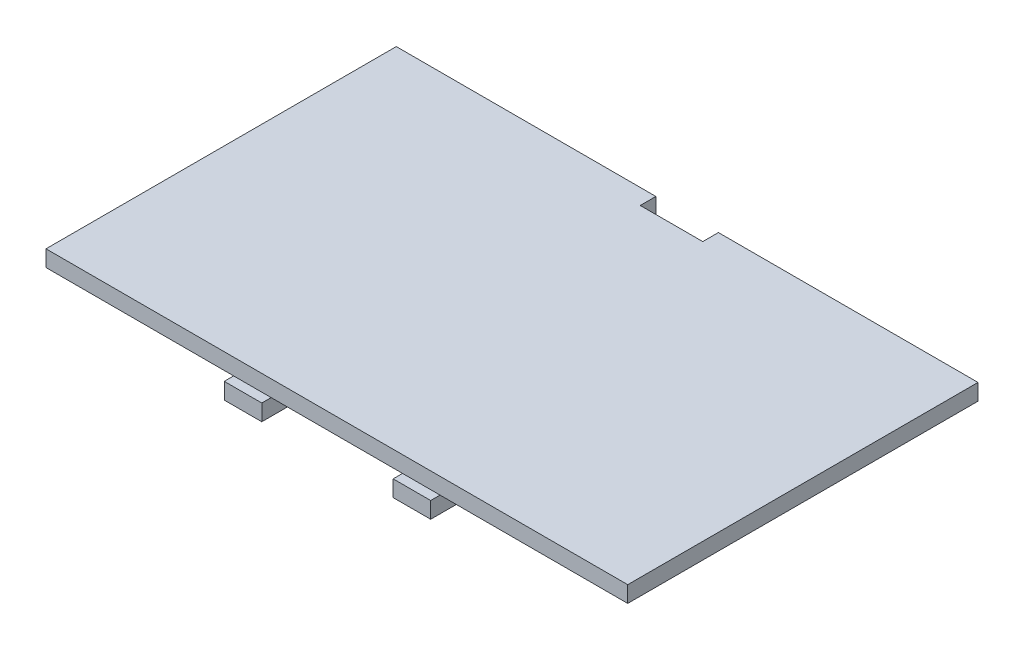
ISO-10303-21;
HEADER;
FILE_DESCRIPTION(('STEP AP214'),'2;1');
FILE_NAME('part.step','',(''),(''),'','','');
FILE_SCHEMA(('AUTOMOTIVE_DESIGN { 1 0 10303 214 1 1 1 1 }'));
ENDSEC;
DATA;
#1=APPLICATION_CONTEXT('core data for automotive mechanical design processes');
#2=APPLICATION_PROTOCOL_DEFINITION('international standard','automotive_design',2000,#1);
#3=PRODUCT_CONTEXT('',#1,'mechanical');
#4=PRODUCT('Part','Part','',(#3));
#5=PRODUCT_RELATED_PRODUCT_CATEGORY('part','',(#4));
#6=PRODUCT_DEFINITION_FORMATION('','',#4);
#7=PRODUCT_DEFINITION_CONTEXT('part definition',#1,'design');
#8=PRODUCT_DEFINITION('design','',#6,#7);
#9=PRODUCT_DEFINITION_SHAPE('','',#8);
#10=(LENGTH_UNIT() NAMED_UNIT(*) SI_UNIT(.MILLI.,.METRE.));
#11=(NAMED_UNIT(*) PLANE_ANGLE_UNIT() SI_UNIT($,.RADIAN.));
#12=(NAMED_UNIT(*) SI_UNIT($,.STERADIAN.) SOLID_ANGLE_UNIT());
#13=UNCERTAINTY_MEASURE_WITH_UNIT(LENGTH_MEASURE(1.E-05),#10,'distance_accuracy_value','');
#14=(GEOMETRIC_REPRESENTATION_CONTEXT(3) GLOBAL_UNCERTAINTY_ASSIGNED_CONTEXT((#13)) GLOBAL_UNIT_ASSIGNED_CONTEXT((#10,
#11,#12)) REPRESENTATION_CONTEXT('',''));
#15=CARTESIAN_POINT('',(0.,0.,0.));
#16=DIRECTION('',(0.,0.,1.));
#17=DIRECTION('',(1.,0.,0.));
#18=AXIS2_PLACEMENT_3D('',#15,#16,#17);
#19=CARTESIAN_POINT('',(-46.5,2.6,-28.));
#20=DIRECTION('',(0.,0.,1.));
#21=DIRECTION('',(1.,0.,0.));
#22=AXIS2_PLACEMENT_3D('',#19,#20,#21);
#23=PLANE('',#22);
#24=DIRECTION('',(0.,1.,0.));
#25=VECTOR('',#24,1.);
#26=CARTESIAN_POINT('',(4.99999999999999,0.,-28.));
#27=LINE('',#26,#25);
#28=CARTESIAN_POINT('',(4.99999999999999,0.,-28.));
#29=VERTEX_POINT('',#28);
#30=CARTESIAN_POINT('',(4.99999999999999,2.6,-28.));
#31=VERTEX_POINT('',#30);
#32=EDGE_CURVE('E280',#29,#31,#27,.T.);
#33=ORIENTED_EDGE('',*,*,#32,.T.);
#34=DIRECTION('',(-1.,0.,0.));
#35=VECTOR('',#34,1.);
#36=CARTESIAN_POINT('',(-46.5,2.6,-28.));
#37=LINE('',#36,#35);
#38=CARTESIAN_POINT('',(46.5,2.6,-28.));
#39=VERTEX_POINT('',#38);
#40=EDGE_CURVE('E289',#39,#31,#37,.T.);
#41=ORIENTED_EDGE('',*,*,#40,.F.);
#42=DIRECTION('',(0.,-1.,0.));
#43=VECTOR('',#42,1.);
#44=CARTESIAN_POINT('',(46.5,2.6,-28.));
#45=LINE('',#44,#43);
#46=CARTESIAN_POINT('',(46.5,0.,-28.));
#47=VERTEX_POINT('',#46);
#48=EDGE_CURVE('E12',#39,#47,#45,.T.);
#49=ORIENTED_EDGE('',*,*,#48,.T.);
#50=DIRECTION('',(-1.,0.,0.));
#51=VECTOR('',#50,1.);
#52=CARTESIAN_POINT('',(-46.5,0.,-28.));
#53=LINE('',#52,#51);
#54=EDGE_CURVE('E300',#47,#29,#53,.T.);
#55=ORIENTED_EDGE('',*,*,#54,.T.);
#56=EDGE_LOOP('',(#33,#41,#49,#55));
#57=FACE_BOUND('',#56,.T.);
#58=ADVANCED_FACE('F60',(#57),#23,.F.);
#59=DIRECTION('',(0.,1.,0.));
#60=VECTOR('',#59,1.);
#61=CARTESIAN_POINT('',(-5.00000000000001,0.,-28.));
#62=LINE('',#61,#60);
#63=CARTESIAN_POINT('',(-5.00000000000001,0.,-28.));
#64=VERTEX_POINT('',#63);
#65=CARTESIAN_POINT('',(-5.00000000000001,2.6,-28.));
#66=VERTEX_POINT('',#65);
#67=EDGE_CURVE('E267',#64,#66,#62,.T.);
#68=ORIENTED_EDGE('',*,*,#67,.F.);
#69=CARTESIAN_POINT('',(-46.5,0.,-28.));
#70=VERTEX_POINT('',#69);
#71=EDGE_CURVE('E299',#64,#70,#53,.T.);
#72=ORIENTED_EDGE('',*,*,#71,.T.);
#73=DIRECTION('',(0.,-1.,0.));
#74=VECTOR('',#73,1.);
#75=CARTESIAN_POINT('',(-46.5,2.6,-28.));
#76=LINE('',#75,#74);
#77=CARTESIAN_POINT('',(-46.5,2.6,-28.));
#78=VERTEX_POINT('',#77);
#79=EDGE_CURVE('E68',#78,#70,#76,.T.);
#80=ORIENTED_EDGE('',*,*,#79,.F.);
#81=EDGE_CURVE('E287',#66,#78,#37,.T.);
#82=ORIENTED_EDGE('',*,*,#81,.F.);
#83=EDGE_LOOP('',(#68,#72,#80,#82));
#84=FACE_BOUND('',#83,.T.);
#85=ADVANCED_FACE('F335',(#84),#23,.F.);
#86=CARTESIAN_POINT('',(0.,2.6,0.));
#87=DIRECTION('',(0.,-1.,0.));
#88=DIRECTION('',(0.,0.,-1.));
#89=AXIS2_PLACEMENT_3D('',#86,#87,#88);
#90=PLANE('',#89);
#91=DIRECTION('',(0.,0.,1.));
#92=VECTOR('',#91,1.);
#93=CARTESIAN_POINT('',(4.99999999999999,2.6,-28.));
#94=LINE('',#93,#92);
#95=CARTESIAN_POINT('',(4.99999999999999,2.6,-25.5));
#96=VERTEX_POINT('',#95);
#97=EDGE_CURVE('E258',#31,#96,#94,.T.);
#98=ORIENTED_EDGE('',*,*,#97,.T.);
#99=DIRECTION('',(-1.,0.,0.));
#100=VECTOR('',#99,1.);
#101=CARTESIAN_POINT('',(4.99999999999999,2.6,-25.5));
#102=LINE('',#101,#100);
#103=CARTESIAN_POINT('',(-5.00000000000001,2.6,-25.5));
#104=VERTEX_POINT('',#103);
#105=EDGE_CURVE('E270',#96,#104,#102,.T.);
#106=ORIENTED_EDGE('',*,*,#105,.T.);
#107=DIRECTION('',(0.,0.,-1.));
#108=VECTOR('',#107,1.);
#109=CARTESIAN_POINT('',(-5.00000000000001,2.6,-25.5));
#110=LINE('',#109,#108);
#111=EDGE_CURVE('E262',#104,#66,#110,.T.);
#112=ORIENTED_EDGE('',*,*,#111,.T.);
#113=ORIENTED_EDGE('',*,*,#81,.T.);
#114=DIRECTION('',(0.,0.,1.));
#115=VECTOR('',#114,1.);
#116=CARTESIAN_POINT('',(-46.5,2.6,28.));
#117=LINE('',#116,#115);
#118=CARTESIAN_POINT('',(-46.5,2.6,28.));
#119=VERTEX_POINT('',#118);
#120=EDGE_CURVE('E292',#78,#119,#117,.T.);
#121=ORIENTED_EDGE('',*,*,#120,.T.);
#122=DIRECTION('',(1.,0.,0.));
#123=VECTOR('',#122,1.);
#124=CARTESIAN_POINT('',(-46.5,2.6,28.));
#125=LINE('',#124,#123);
#126=CARTESIAN_POINT('',(46.5,2.6,28.));
#127=VERTEX_POINT('',#126);
#128=EDGE_CURVE('E294',#119,#127,#125,.T.);
#129=ORIENTED_EDGE('',*,*,#128,.T.);
#130=DIRECTION('',(0.,0.,-1.));
#131=VECTOR('',#130,1.);
#132=CARTESIAN_POINT('',(46.5,2.6,28.));
#133=LINE('',#132,#131);
#134=EDGE_CURVE('E284',#127,#39,#133,.T.);
#135=ORIENTED_EDGE('',*,*,#134,.T.);
#136=ORIENTED_EDGE('',*,*,#40,.T.);
#137=EDGE_LOOP('',(#98,#106,#112,#113,#121,#129,#135,#136));
#138=FACE_BOUND('',#137,.T.);
#139=ADVANCED_FACE('F331',(#138),#90,.F.);
#140=CARTESIAN_POINT('',(0.,0.,0.));
#141=DIRECTION('',(0.,-1.,0.));
#142=DIRECTION('',(0.,0.,-1.));
#143=AXIS2_PLACEMENT_3D('',#140,#141,#142);
#144=PLANE('',#143);
#145=DIRECTION('',(0.,0.,-1.));
#146=VECTOR('',#145,1.);
#147=CARTESIAN_POINT('',(-10.5,0.,0.));
#148=LINE('',#147,#146);
#149=CARTESIAN_POINT('',(-10.5,0.,28.));
#150=VERTEX_POINT('',#149);
#151=CARTESIAN_POINT('',(-10.5,0.,25.));
#152=VERTEX_POINT('',#151);
#153=EDGE_CURVE('E191',#150,#152,#148,.T.);
#154=ORIENTED_EDGE('',*,*,#153,.T.);
#155=DIRECTION('',(-1.,0.,0.));
#156=VECTOR('',#155,1.);
#157=CARTESIAN_POINT('',(0.,0.,25.));
#158=LINE('',#157,#156);
#159=CARTESIAN_POINT('',(-16.5,0.,25.));
#160=VERTEX_POINT('',#159);
#161=EDGE_CURVE('E202',#152,#160,#158,.T.);
#162=ORIENTED_EDGE('',*,*,#161,.T.);
#163=DIRECTION('',(0.,0.,-1.));
#164=VECTOR('',#163,1.);
#165=CARTESIAN_POINT('',(-16.5000000000001,0.,0.));
#166=LINE('',#165,#164);
#167=CARTESIAN_POINT('',(-16.5,0.,28.));
#168=VERTEX_POINT('',#167);
#169=EDGE_CURVE('E207',#168,#160,#166,.T.);
#170=ORIENTED_EDGE('',*,*,#169,.F.);
#171=DIRECTION('',(1.,0.,0.));
#172=VECTOR('',#171,1.);
#173=CARTESIAN_POINT('',(-46.5,0.,28.));
#174=LINE('',#173,#172);
#175=CARTESIAN_POINT('',(-46.5,0.,28.));
#176=VERTEX_POINT('',#175);
#177=EDGE_CURVE('E288',#176,#168,#174,.T.);
#178=ORIENTED_EDGE('',*,*,#177,.F.);
#179=DIRECTION('',(0.,0.,1.));
#180=VECTOR('',#179,1.);
#181=CARTESIAN_POINT('',(-46.5,0.,28.));
#182=LINE('',#181,#180);
#183=EDGE_CURVE('E303',#70,#176,#182,.T.);
#184=ORIENTED_EDGE('',*,*,#183,.F.);
#185=ORIENTED_EDGE('',*,*,#71,.F.);
#186=DIRECTION('',(0.,0.,-1.));
#187=VECTOR('',#186,1.);
#188=CARTESIAN_POINT('',(-5.00000000000001,0.,-25.5));
#189=LINE('',#188,#187);
#190=CARTESIAN_POINT('',(-5.00000000000001,0.,-25.5));
#191=VERTEX_POINT('',#190);
#192=EDGE_CURVE('E265',#191,#64,#189,.T.);
#193=ORIENTED_EDGE('',*,*,#192,.F.);
#194=DIRECTION('',(-1.,0.,0.));
#195=VECTOR('',#194,1.);
#196=CARTESIAN_POINT('',(4.99999999999999,0.,-25.5));
#197=LINE('',#196,#195);
#198=CARTESIAN_POINT('',(4.99999999999999,0.,-25.5));
#199=VERTEX_POINT('',#198);
#200=EDGE_CURVE('E261',#199,#191,#197,.T.);
#201=ORIENTED_EDGE('',*,*,#200,.F.);
#202=DIRECTION('',(0.,0.,1.));
#203=VECTOR('',#202,1.);
#204=CARTESIAN_POINT('',(4.99999999999999,0.,-28.));
#205=LINE('',#204,#203);
#206=EDGE_CURVE('E259',#29,#199,#205,.T.);
#207=ORIENTED_EDGE('',*,*,#206,.F.);
#208=ORIENTED_EDGE('',*,*,#54,.F.);
#209=DIRECTION('',(0.,0.,-1.));
#210=VECTOR('',#209,1.);
#211=CARTESIAN_POINT('',(46.5,0.,28.));
#212=LINE('',#211,#210);
#213=CARTESIAN_POINT('',(46.5,0.,28.));
#214=VERTEX_POINT('',#213);
#215=EDGE_CURVE('E283',#214,#47,#212,.T.);
#216=ORIENTED_EDGE('',*,*,#215,.F.);
#217=CARTESIAN_POINT('',(16.5,0.,28.));
#218=VERTEX_POINT('',#217);
#219=EDGE_CURVE('E305',#218,#214,#174,.T.);
#220=ORIENTED_EDGE('',*,*,#219,.F.);
#221=DIRECTION('',(0.,0.,1.));
#222=VECTOR('',#221,1.);
#223=CARTESIAN_POINT('',(16.5,0.,0.));
#224=LINE('',#223,#222);
#225=CARTESIAN_POINT('',(16.5,0.,25.));
#226=VERTEX_POINT('',#225);
#227=EDGE_CURVE('E229',#226,#218,#224,.T.);
#228=ORIENTED_EDGE('',*,*,#227,.F.);
#229=DIRECTION('',(-1.,0.,0.));
#230=VECTOR('',#229,1.);
#231=CARTESIAN_POINT('',(0.,0.,25.));
#232=LINE('',#231,#230);
#233=CARTESIAN_POINT('',(10.5,0.,25.));
#234=VERTEX_POINT('',#233);
#235=EDGE_CURVE('E243',#226,#234,#232,.T.);
#236=ORIENTED_EDGE('',*,*,#235,.T.);
#237=DIRECTION('',(0.,0.,1.));
#238=VECTOR('',#237,1.);
#239=CARTESIAN_POINT('',(10.5,0.,0.));
#240=LINE('',#239,#238);
#241=CARTESIAN_POINT('',(10.5,0.,28.));
#242=VERTEX_POINT('',#241);
#243=EDGE_CURVE('E241',#234,#242,#240,.T.);
#244=ORIENTED_EDGE('',*,*,#243,.T.);
#245=EDGE_CURVE('E83',#150,#242,#174,.T.);
#246=ORIENTED_EDGE('',*,*,#245,.F.);
#247=EDGE_LOOP('',(#154,#162,#170,#178,#184,#185,#193,#201,#207,#208,#216,#220,#228,#236,#244,#246));
#248=FACE_BOUND('',#247,.T.);
#249=ADVANCED_FACE('F209',(#248),#144,.T.);
#250=CARTESIAN_POINT('',(46.5,2.6,28.));
#251=DIRECTION('',(-1.,0.,0.));
#252=DIRECTION('',(0.,0.,1.));
#253=AXIS2_PLACEMENT_3D('',#250,#251,#252);
#254=PLANE('',#253);
#255=ORIENTED_EDGE('',*,*,#215,.T.);
#256=ORIENTED_EDGE('',*,*,#48,.F.);
#257=ORIENTED_EDGE('',*,*,#134,.F.);
#258=DIRECTION('',(0.,-1.,0.));
#259=VECTOR('',#258,1.);
#260=CARTESIAN_POINT('',(46.5,2.6,28.));
#261=LINE('',#260,#259);
#262=EDGE_CURVE('E296',#127,#214,#261,.T.);
#263=ORIENTED_EDGE('',*,*,#262,.T.);
#264=EDGE_LOOP('',(#255,#256,#257,#263));
#265=FACE_BOUND('',#264,.T.);
#266=ADVANCED_FACE('F62',(#265),#254,.F.);
#267=CARTESIAN_POINT('',(-46.5,2.6,28.));
#268=DIRECTION('',(1.,0.,0.));
#269=DIRECTION('',(0.,0.,-1.));
#270=AXIS2_PLACEMENT_3D('',#267,#268,#269);
#271=PLANE('',#270);
#272=ORIENTED_EDGE('',*,*,#183,.T.);
#273=DIRECTION('',(0.,-1.,0.));
#274=VECTOR('',#273,1.);
#275=CARTESIAN_POINT('',(-46.5,2.6,28.));
#276=LINE('',#275,#274);
#277=EDGE_CURVE('E312',#119,#176,#276,.T.);
#278=ORIENTED_EDGE('',*,*,#277,.F.);
#279=ORIENTED_EDGE('',*,*,#120,.F.);
#280=ORIENTED_EDGE('',*,*,#79,.T.);
#281=EDGE_LOOP('',(#272,#278,#279,#280));
#282=FACE_BOUND('',#281,.T.);
#283=ADVANCED_FACE('F319',(#282),#271,.F.);
#284=CARTESIAN_POINT('',(-46.5,2.6,28.));
#285=DIRECTION('',(0.,0.,-1.));
#286=DIRECTION('',(-1.,0.,0.));
#287=AXIS2_PLACEMENT_3D('',#284,#285,#286);
#288=PLANE('',#287);
#289=ORIENTED_EDGE('',*,*,#177,.T.);
#290=EDGE_CURVE('E308',#168,#150,#174,.T.);
#291=ORIENTED_EDGE('',*,*,#290,.T.);
#292=ORIENTED_EDGE('',*,*,#245,.T.);
#293=EDGE_CURVE('E309',#242,#218,#174,.T.);
#294=ORIENTED_EDGE('',*,*,#293,.T.);
#295=ORIENTED_EDGE('',*,*,#219,.T.);
#296=ORIENTED_EDGE('',*,*,#262,.F.);
#297=ORIENTED_EDGE('',*,*,#128,.F.);
#298=ORIENTED_EDGE('',*,*,#277,.T.);
#299=EDGE_LOOP('',(#289,#291,#292,#294,#295,#296,#297,#298));
#300=FACE_BOUND('',#299,.T.);
#301=ADVANCED_FACE('F326',(#300),#288,.F.);
#302=CARTESIAN_POINT('',(4.99999999999999,0.,-28.));
#303=DIRECTION('',(-1.,0.,0.));
#304=DIRECTION('',(0.,0.,1.));
#305=AXIS2_PLACEMENT_3D('',#302,#303,#304);
#306=PLANE('',#305);
#307=ORIENTED_EDGE('',*,*,#97,.F.);
#308=ORIENTED_EDGE('',*,*,#32,.F.);
#309=ORIENTED_EDGE('',*,*,#206,.T.);
#310=DIRECTION('',(0.,1.,0.));
#311=VECTOR('',#310,1.);
#312=CARTESIAN_POINT('',(4.99999999999999,0.,-25.5));
#313=LINE('',#312,#311);
#314=EDGE_CURVE('E278',#199,#96,#313,.T.);
#315=ORIENTED_EDGE('',*,*,#314,.T.);
#316=EDGE_LOOP('',(#307,#308,#309,#315));
#317=FACE_BOUND('',#316,.T.);
#318=ADVANCED_FACE('F345',(#317),#306,.T.);
#319=CARTESIAN_POINT('',(4.99999999999999,0.,-25.5));
#320=DIRECTION('',(0.,0.,-1.));
#321=DIRECTION('',(-1.,0.,0.));
#322=AXIS2_PLACEMENT_3D('',#319,#320,#321);
#323=PLANE('',#322);
#324=ORIENTED_EDGE('',*,*,#105,.F.);
#325=ORIENTED_EDGE('',*,*,#314,.F.);
#326=ORIENTED_EDGE('',*,*,#200,.T.);
#327=DIRECTION('',(0.,1.,0.));
#328=VECTOR('',#327,1.);
#329=CARTESIAN_POINT('',(-5.00000000000001,0.,-25.5));
#330=LINE('',#329,#328);
#331=EDGE_CURVE('E276',#191,#104,#330,.T.);
#332=ORIENTED_EDGE('',*,*,#331,.T.);
#333=EDGE_LOOP('',(#324,#325,#326,#332));
#334=FACE_BOUND('',#333,.T.);
#335=ADVANCED_FACE('F343',(#334),#323,.T.);
#336=CARTESIAN_POINT('',(-5.00000000000001,0.,-25.5));
#337=DIRECTION('',(1.,0.,0.));
#338=DIRECTION('',(0.,0.,-1.));
#339=AXIS2_PLACEMENT_3D('',#336,#337,#338);
#340=PLANE('',#339);
#341=ORIENTED_EDGE('',*,*,#111,.F.);
#342=ORIENTED_EDGE('',*,*,#331,.F.);
#343=ORIENTED_EDGE('',*,*,#192,.T.);
#344=ORIENTED_EDGE('',*,*,#67,.T.);
#345=EDGE_LOOP('',(#341,#342,#343,#344));
#346=FACE_BOUND('',#345,.T.);
#347=ADVANCED_FACE('F337',(#346),#340,.T.);
#348=CARTESIAN_POINT('',(0.,-2.6,29.5));
#349=DIRECTION('',(0.,0.,1.));
#350=DIRECTION('',(1.,0.,0.));
#351=AXIS2_PLACEMENT_3D('',#348,#349,#350);
#352=PLANE('',#351);
#353=DIRECTION('',(1.,0.,0.));
#354=VECTOR('',#353,1.);
#355=CARTESIAN_POINT('',(0.,0.,29.5));
#356=LINE('',#355,#354);
#357=CARTESIAN_POINT('',(10.5,0.,29.5));
#358=VERTEX_POINT('',#357);
#359=CARTESIAN_POINT('',(16.5,0.,29.5));
#360=VERTEX_POINT('',#359);
#361=EDGE_CURVE('E213',#358,#360,#356,.T.);
#362=ORIENTED_EDGE('',*,*,#361,.F.);
#363=DIRECTION('',(0.,1.,0.));
#364=VECTOR('',#363,1.);
#365=CARTESIAN_POINT('',(10.5,-2.6,29.5));
#366=LINE('',#365,#364);
#367=CARTESIAN_POINT('',(10.5,-2.6,29.5));
#368=VERTEX_POINT('',#367);
#369=EDGE_CURVE('E255',#368,#358,#366,.T.);
#370=ORIENTED_EDGE('',*,*,#369,.F.);
#371=DIRECTION('',(1.,0.,0.));
#372=VECTOR('',#371,1.);
#373=CARTESIAN_POINT('',(0.,-2.6,29.5));
#374=LINE('',#373,#372);
#375=CARTESIAN_POINT('',(16.5,-2.6,29.5));
#376=VERTEX_POINT('',#375);
#377=EDGE_CURVE('E225',#368,#376,#374,.T.);
#378=ORIENTED_EDGE('',*,*,#377,.T.);
#379=DIRECTION('',(0.,1.,0.));
#380=VECTOR('',#379,1.);
#381=CARTESIAN_POINT('',(16.5,-2.6,29.5));
#382=LINE('',#381,#380);
#383=EDGE_CURVE('E237',#376,#360,#382,.T.);
#384=ORIENTED_EDGE('',*,*,#383,.T.);
#385=EDGE_LOOP('',(#362,#370,#378,#384));
#386=FACE_BOUND('',#385,.T.);
#387=ADVANCED_FACE('F373',(#386),#352,.T.);
#388=CARTESIAN_POINT('',(10.5,-2.6,0.));
#389=DIRECTION('',(-1.,0.,0.));
#390=DIRECTION('',(0.,0.,1.));
#391=AXIS2_PLACEMENT_3D('',#388,#389,#390);
#392=PLANE('',#391);
#393=ORIENTED_EDGE('',*,*,#243,.F.);
#394=DIRECTION('',(0.,1.,0.));
#395=VECTOR('',#394,1.);
#396=CARTESIAN_POINT('',(10.5,-2.6,25.));
#397=LINE('',#396,#395);
#398=CARTESIAN_POINT('',(10.5,-2.6,25.));
#399=VERTEX_POINT('',#398);
#400=EDGE_CURVE('E253',#399,#234,#397,.T.);
#401=ORIENTED_EDGE('',*,*,#400,.F.);
#402=DIRECTION('',(0.,0.,1.));
#403=VECTOR('',#402,1.);
#404=CARTESIAN_POINT('',(10.5,-2.6,0.));
#405=LINE('',#404,#403);
#406=EDGE_CURVE('E228',#399,#368,#405,.T.);
#407=ORIENTED_EDGE('',*,*,#406,.T.);
#408=ORIENTED_EDGE('',*,*,#369,.T.);
#409=EDGE_CURVE('E240',#242,#358,#240,.T.);
#410=ORIENTED_EDGE('',*,*,#409,.F.);
#411=EDGE_LOOP('',(#393,#401,#407,#408,#410));
#412=FACE_BOUND('',#411,.T.);
#413=ADVANCED_FACE('F376',(#412),#392,.T.);
#414=CARTESIAN_POINT('',(0.,-2.6,25.));
#415=DIRECTION('',(0.,0.,-1.));
#416=DIRECTION('',(-1.,0.,0.));
#417=AXIS2_PLACEMENT_3D('',#414,#415,#416);
#418=PLANE('',#417);
#419=ORIENTED_EDGE('',*,*,#235,.F.);
#420=DIRECTION('',(0.,1.,0.));
#421=VECTOR('',#420,1.);
#422=CARTESIAN_POINT('',(16.5,-2.6,25.));
#423=LINE('',#422,#421);
#424=CARTESIAN_POINT('',(16.5,-2.6,25.));
#425=VERTEX_POINT('',#424);
#426=EDGE_CURVE('E251',#425,#226,#423,.T.);
#427=ORIENTED_EDGE('',*,*,#426,.F.);
#428=DIRECTION('',(-1.,0.,0.));
#429=VECTOR('',#428,1.);
#430=CARTESIAN_POINT('',(0.,-2.6,25.));
#431=LINE('',#430,#429);
#432=EDGE_CURVE('E232',#425,#399,#431,.T.);
#433=ORIENTED_EDGE('',*,*,#432,.T.);
#434=ORIENTED_EDGE('',*,*,#400,.T.);
#435=EDGE_LOOP('',(#419,#427,#433,#434));
#436=FACE_BOUND('',#435,.T.);
#437=ADVANCED_FACE('F380',(#436),#418,.T.);
#438=CARTESIAN_POINT('',(16.5,-2.6,0.));
#439=DIRECTION('',(-1.,0.,0.));
#440=DIRECTION('',(0.,0.,1.));
#441=AXIS2_PLACEMENT_3D('',#438,#439,#440);
#442=PLANE('',#441);
#443=ORIENTED_EDGE('',*,*,#227,.T.);
#444=EDGE_CURVE('E246',#218,#360,#224,.T.);
#445=ORIENTED_EDGE('',*,*,#444,.T.);
#446=ORIENTED_EDGE('',*,*,#383,.F.);
#447=DIRECTION('',(0.,0.,1.));
#448=VECTOR('',#447,1.);
#449=CARTESIAN_POINT('',(16.5,-2.6,0.));
#450=LINE('',#449,#448);
#451=EDGE_CURVE('E235',#425,#376,#450,.T.);
#452=ORIENTED_EDGE('',*,*,#451,.F.);
#453=ORIENTED_EDGE('',*,*,#426,.T.);
#454=EDGE_LOOP('',(#443,#445,#446,#452,#453));
#455=FACE_BOUND('',#454,.T.);
#456=ADVANCED_FACE('F384',(#455),#442,.F.);
#457=CARTESIAN_POINT('',(0.,-2.6,0.));
#458=DIRECTION('',(0.,-1.,0.));
#459=DIRECTION('',(0.,0.,-1.));
#460=AXIS2_PLACEMENT_3D('',#457,#458,#459);
#461=PLANE('',#460);
#462=ORIENTED_EDGE('',*,*,#377,.F.);
#463=ORIENTED_EDGE('',*,*,#406,.F.);
#464=ORIENTED_EDGE('',*,*,#432,.F.);
#465=ORIENTED_EDGE('',*,*,#451,.T.);
#466=EDGE_LOOP('',(#462,#463,#464,#465));
#467=FACE_BOUND('',#466,.T.);
#468=ADVANCED_FACE('F388',(#467),#461,.T.);
#469=CARTESIAN_POINT('',(0.,0.,0.));
#470=DIRECTION('',(0.,-1.,0.));
#471=DIRECTION('',(0.,0.,-1.));
#472=AXIS2_PLACEMENT_3D('',#469,#470,#471);
#473=PLANE('',#472);
#474=ORIENTED_EDGE('',*,*,#293,.F.);
#475=ORIENTED_EDGE('',*,*,#409,.T.);
#476=ORIENTED_EDGE('',*,*,#361,.T.);
#477=ORIENTED_EDGE('',*,*,#444,.F.);
#478=EDGE_LOOP('',(#474,#475,#476,#477));
#479=FACE_BOUND('',#478,.T.);
#480=ADVANCED_FACE('F390',(#479),#473,.F.);
#481=CARTESIAN_POINT('',(0.,0.,0.));
#482=DIRECTION('',(0.,-1.,0.));
#483=DIRECTION('',(0.,0.,-1.));
#484=AXIS2_PLACEMENT_3D('',#481,#482,#483);
#485=PLANE('',#484);
#486=CARTESIAN_POINT('',(-10.5,0.,29.5));
#487=VERTEX_POINT('',#486);
#488=EDGE_CURVE('E75',#487,#150,#148,.T.);
#489=ORIENTED_EDGE('',*,*,#488,.T.);
#490=ORIENTED_EDGE('',*,*,#290,.F.);
#491=CARTESIAN_POINT('',(-16.5,0.,29.5));
#492=VERTEX_POINT('',#491);
#493=EDGE_CURVE('E214',#492,#168,#166,.T.);
#494=ORIENTED_EDGE('',*,*,#493,.F.);
#495=DIRECTION('',(1.,0.,0.));
#496=VECTOR('',#495,1.);
#497=CARTESIAN_POINT('',(0.,0.,29.5));
#498=LINE('',#497,#496);
#499=EDGE_CURVE('E211',#492,#487,#498,.T.);
#500=ORIENTED_EDGE('',*,*,#499,.T.);
#501=EDGE_LOOP('',(#489,#490,#494,#500));
#502=FACE_BOUND('',#501,.T.);
#503=ADVANCED_FACE('F393',(#502),#485,.F.);
#504=CARTESIAN_POINT('',(-10.5,-2.6,0.));
#505=DIRECTION('',(1.,0.,0.));
#506=DIRECTION('',(0.,0.,-1.));
#507=AXIS2_PLACEMENT_3D('',#504,#505,#506);
#508=PLANE('',#507);
#509=ORIENTED_EDGE('',*,*,#488,.F.);
#510=DIRECTION('',(0.,1.,0.));
#511=VECTOR('',#510,1.);
#512=CARTESIAN_POINT('',(-10.5,-2.6,29.5));
#513=LINE('',#512,#511);
#514=CARTESIAN_POINT('',(-10.5,-2.6,29.5));
#515=VERTEX_POINT('',#514);
#516=EDGE_CURVE('E579',#515,#487,#513,.T.);
#517=ORIENTED_EDGE('',*,*,#516,.F.);
#518=DIRECTION('',(0.,0.,-1.));
#519=VECTOR('',#518,1.);
#520=CARTESIAN_POINT('',(-10.5,-2.6,0.));
#521=LINE('',#520,#519);
#522=CARTESIAN_POINT('',(-10.5,-2.6,25.));
#523=VERTEX_POINT('',#522);
#524=EDGE_CURVE('E193',#515,#523,#521,.T.);
#525=ORIENTED_EDGE('',*,*,#524,.T.);
#526=DIRECTION('',(0.,1.,0.));
#527=VECTOR('',#526,1.);
#528=CARTESIAN_POINT('',(-10.5,-2.6,25.));
#529=LINE('',#528,#527);
#530=EDGE_CURVE('E187',#523,#152,#529,.T.);
#531=ORIENTED_EDGE('',*,*,#530,.T.);
#532=ORIENTED_EDGE('',*,*,#153,.F.);
#533=EDGE_LOOP('',(#509,#517,#525,#531,#532));
#534=FACE_BOUND('',#533,.T.);
#535=ADVANCED_FACE('F189',(#534),#508,.T.);
#536=CARTESIAN_POINT('',(0.,-2.6,25.));
#537=DIRECTION('',(0.,0.,-1.));
#538=DIRECTION('',(-1.,0.,0.));
#539=AXIS2_PLACEMENT_3D('',#536,#537,#538);
#540=PLANE('',#539);
#541=ORIENTED_EDGE('',*,*,#161,.F.);
#542=ORIENTED_EDGE('',*,*,#530,.F.);
#543=DIRECTION('',(-1.,0.,0.));
#544=VECTOR('',#543,1.);
#545=CARTESIAN_POINT('',(0.,-2.6,25.));
#546=LINE('',#545,#544);
#547=CARTESIAN_POINT('',(-16.5,-2.6,25.));
#548=VERTEX_POINT('',#547);
#549=EDGE_CURVE('E197',#523,#548,#546,.T.);
#550=ORIENTED_EDGE('',*,*,#549,.T.);
#551=DIRECTION('',(0.,1.,0.));
#552=VECTOR('',#551,1.);
#553=CARTESIAN_POINT('',(-16.5,-2.6,25.));
#554=LINE('',#553,#552);
#555=EDGE_CURVE('E198',#548,#160,#554,.T.);
#556=ORIENTED_EDGE('',*,*,#555,.T.);
#557=EDGE_LOOP('',(#541,#542,#550,#556));
#558=FACE_BOUND('',#557,.T.);
#559=ADVANCED_FACE('F203',(#558),#540,.T.);
#560=CARTESIAN_POINT('',(-16.5000000000001,-2.6,0.));
#561=DIRECTION('',(1.,0.,0.));
#562=DIRECTION('',(0.,0.,-1.));
#563=AXIS2_PLACEMENT_3D('',#560,#561,#562);
#564=PLANE('',#563);
#565=ORIENTED_EDGE('',*,*,#493,.T.);
#566=ORIENTED_EDGE('',*,*,#169,.T.);
#567=ORIENTED_EDGE('',*,*,#555,.F.);
#568=DIRECTION('',(0.,0.,-1.));
#569=VECTOR('',#568,1.);
#570=CARTESIAN_POINT('',(-16.5000000000001,-2.6,0.));
#571=LINE('',#570,#569);
#572=CARTESIAN_POINT('',(-16.5,-2.6,29.5));
#573=VERTEX_POINT('',#572);
#574=EDGE_CURVE('E219',#573,#548,#571,.T.);
#575=ORIENTED_EDGE('',*,*,#574,.F.);
#576=DIRECTION('',(0.,1.,0.));
#577=VECTOR('',#576,1.);
#578=CARTESIAN_POINT('',(-16.5,-2.6,29.5));
#579=LINE('',#578,#577);
#580=EDGE_CURVE('E577',#573,#492,#579,.T.);
#581=ORIENTED_EDGE('',*,*,#580,.T.);
#582=EDGE_LOOP('',(#565,#566,#567,#575,#581));
#583=FACE_BOUND('',#582,.T.);
#584=ADVANCED_FACE('F407',(#583),#564,.F.);
#585=CARTESIAN_POINT('',(0.,-2.6,29.5));
#586=DIRECTION('',(0.,0.,1.));
#587=DIRECTION('',(1.,0.,0.));
#588=AXIS2_PLACEMENT_3D('',#585,#586,#587);
#589=PLANE('',#588);
#590=ORIENTED_EDGE('',*,*,#499,.F.);
#591=ORIENTED_EDGE('',*,*,#580,.F.);
#592=DIRECTION('',(1.,0.,0.));
#593=VECTOR('',#592,1.);
#594=CARTESIAN_POINT('',(0.,-2.6,29.5));
#595=LINE('',#594,#593);
#596=EDGE_CURVE('E221',#573,#515,#595,.T.);
#597=ORIENTED_EDGE('',*,*,#596,.T.);
#598=ORIENTED_EDGE('',*,*,#516,.T.);
#599=EDGE_LOOP('',(#590,#591,#597,#598));
#600=FACE_BOUND('',#599,.T.);
#601=ADVANCED_FACE('F401',(#600),#589,.T.);
#602=CARTESIAN_POINT('',(0.,-2.6,0.));
#603=DIRECTION('',(0.,-1.,0.));
#604=DIRECTION('',(0.,0.,-1.));
#605=AXIS2_PLACEMENT_3D('',#602,#603,#604);
#606=PLANE('',#605);
#607=ORIENTED_EDGE('',*,*,#524,.F.);
#608=ORIENTED_EDGE('',*,*,#596,.F.);
#609=ORIENTED_EDGE('',*,*,#574,.T.);
#610=ORIENTED_EDGE('',*,*,#549,.F.);
#611=EDGE_LOOP('',(#607,#608,#609,#610));
#612=FACE_BOUND('',#611,.T.);
#613=ADVANCED_FACE('F398',(#612),#606,.T.);
#614=CLOSED_SHELL('',(#58,#85,#139,#249,#266,#283,#301,#318,#335,#347,#387,#413,#437,#456,#468,
#480,#503,#535,#559,#584,#601,#613));
#615=MANIFOLD_SOLID_BREP('B2',#614);
#616=ADVANCED_BREP_SHAPE_REPRESENTATION('',(#18,#615),#14);
#617=SHAPE_DEFINITION_REPRESENTATION(#9,#616);
ENDSEC;
END-ISO-10303-21;
